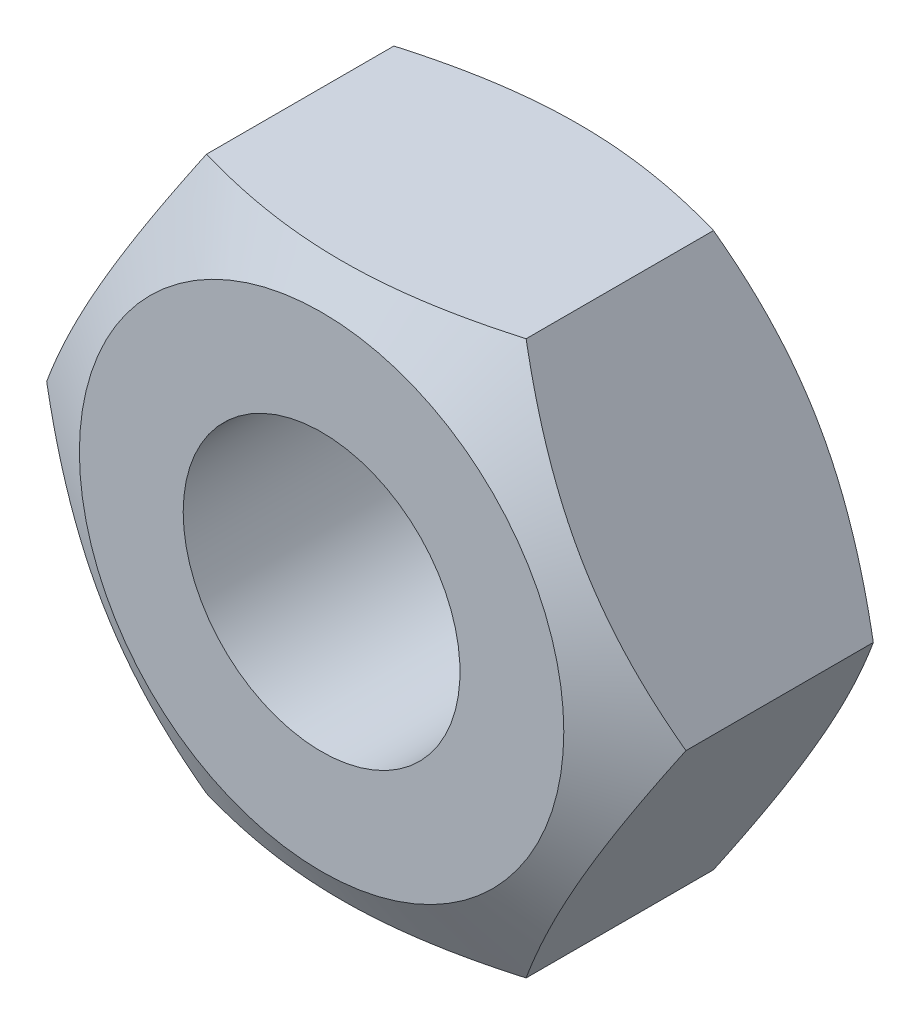
ISO-10303-21;
HEADER;
FILE_DESCRIPTION(('STEP AP214'),'2;1');
FILE_NAME('part.step','',(''),(''),'','','');
FILE_SCHEMA(('AUTOMOTIVE_DESIGN { 1 0 10303 214 1 1 1 1 }'));
ENDSEC;
DATA;
#1=APPLICATION_CONTEXT('core data for automotive mechanical design processes');
#2=APPLICATION_PROTOCOL_DEFINITION('international standard','automotive_design',2000,#1);
#3=PRODUCT_CONTEXT('',#1,'mechanical');
#4=PRODUCT('Part','Part','',(#3));
#5=PRODUCT_RELATED_PRODUCT_CATEGORY('part','',(#4));
#6=PRODUCT_DEFINITION_FORMATION('','',#4);
#7=PRODUCT_DEFINITION_CONTEXT('part definition',#1,'design');
#8=PRODUCT_DEFINITION('design','',#6,#7);
#9=PRODUCT_DEFINITION_SHAPE('','',#8);
#10=(LENGTH_UNIT() NAMED_UNIT(*) SI_UNIT(.MILLI.,.METRE.));
#11=(NAMED_UNIT(*) PLANE_ANGLE_UNIT() SI_UNIT($,.RADIAN.));
#12=(NAMED_UNIT(*) SI_UNIT($,.STERADIAN.) SOLID_ANGLE_UNIT());
#13=UNCERTAINTY_MEASURE_WITH_UNIT(LENGTH_MEASURE(1.E-05),#10,'distance_accuracy_value','');
#14=(GEOMETRIC_REPRESENTATION_CONTEXT(3) GLOBAL_UNCERTAINTY_ASSIGNED_CONTEXT((#13)) GLOBAL_UNIT_ASSIGNED_CONTEXT((#10,
#11,#12)) REPRESENTATION_CONTEXT('',''));
#15=CARTESIAN_POINT('',(0.,0.,0.));
#16=DIRECTION('',(0.,0.,1.));
#17=DIRECTION('',(1.,0.,0.));
#18=AXIS2_PLACEMENT_3D('',#15,#16,#17);
#19=CARTESIAN_POINT('',(0.,0.,5.86282135458305));
#20=DIRECTION('',(0.,0.,-1.));
#21=DIRECTION('',(-1.,0.,0.));
#22=AXIS2_PLACEMENT_3D('',#19,#20,#21);
#23=CONICAL_SURFACE('',#22,8.09465119112929,1.04719755119864);
#24=CARTESIAN_POINT('',(0.,0.,7.00000000002023));
#25=DIRECTION('',(0.,0.,-1.));
#26=DIRECTION('',(-1.,0.,0.));
#27=AXIS2_PLACEMENT_3D('',#24,#25,#26);
#28=CIRCLE('',#27,6.12499999994043);
#29=CARTESIAN_POINT('',(-6.12499999994043,0.,7.00000000002023));
#30=VERTEX_POINT('',#29);
#31=EDGE_CURVE('E20',#30,#30,#28,.F.);
#32=ORIENTED_EDGE('',*,*,#31,.F.);
#33=EDGE_LOOP('',(#32));
#34=FACE_BOUND('',#33,.T.);
#35=CARTESIAN_POINT('',(-4.04145188432504,-7.00000000000002,5.86960373211163));
#36=CARTESIAN_POINT('',(-3.86378247803135,-7.00000000000002,5.92088257720965));
#37=CARTESIAN_POINT('',(-3.68545063654729,-7.00000000000002,5.96983400527788));
#38=CARTESIAN_POINT('',(-3.32733873248749,-7.00000000000002,6.06244103940866));
#39=CARTESIAN_POINT('',(-3.1475580805679,-7.00000000000002,6.10609436093838));
#40=CARTESIAN_POINT('',(-2.60533781451671,-7.00000000000002,6.22825023804331));
#41=CARTESIAN_POINT('',(-2.24075794157661,-7.00000000000002,6.29773001609363));
#42=CARTESIAN_POINT('',(-1.69517083910316,-7.00000000000002,6.37920129290062));
#43=CARTESIAN_POINT('',(-1.51579360730201,-7.00000000000002,6.40240971488172));
#44=CARTESIAN_POINT('',(-1.15622874563318,-7.00000000000002,6.44132591526718));
#45=CARTESIAN_POINT('',(-0.976041188786309,-7.00000000000002,6.45703435636791));
#46=CARTESIAN_POINT('',(-0.615353230628588,-7.00000000000002,6.48055026201443));
#47=CARTESIAN_POINT('',(-0.434853418188718,-7.00000000000002,6.48836669212229));
#48=CARTESIAN_POINT('',(-0.0736971508473852,-7.00000000000002,6.49593936427695));
#49=CARTESIAN_POINT('',(0.106959299040573,-7.00000000000002,6.4956958554197));
#50=CARTESIAN_POINT('',(0.601868045647311,-7.00000000000002,6.48395068731892));
#51=CARTESIAN_POINT('',(0.915958242229462,-7.00000000000002,6.46424356568357));
#52=CARTESIAN_POINT('',(1.54205253151257,-7.00000000000002,6.40175885301141));
#53=CARTESIAN_POINT('',(1.85405442324479,-7.00000000000002,6.35895991638039));
#54=CARTESIAN_POINT('',(2.48140815386124,-7.00000000000002,6.25197764318567));
#55=CARTESIAN_POINT('',(2.79668085475645,-7.00000000000002,6.18734114904723));
#56=CARTESIAN_POINT('',(3.42252533986699,-7.00000000000002,6.04064340283215));
#57=CARTESIAN_POINT('',(3.73310513565769,-7.00000000000002,5.9586165971607));
#58=CARTESIAN_POINT('',(4.04145188432504,-7.00000000000002,5.86960373211163));
#59=B_SPLINE_CURVE_WITH_KNOTS('',3,(#35,#36,#37,#38,#39,#40,#41,#42,#43,#44,#45,#46,#47,#48,#49,
#50,#51,#52,#53,#54,#55,#56,#57,#58),.UNSPECIFIED.,.F.,.F.,(4,2,2,2,2,2,2,2,2,2,2,4),(0.,
0.554720009638788,1.10967836995735,2.22190068910218,2.76439120744652,3.3068337825936,
3.84865943093622,4.39046833393486,5.33360246200363,6.27760990107192,7.2425509015011,
8.20559813009243),.UNSPECIFIED.);
#60=CARTESIAN_POINT('',(-4.04145188432622,-7.00000000000002,5.86960373211129));
#61=VERTEX_POINT('',#60);
#62=CARTESIAN_POINT('',(4.04145188432798,-6.999999999999,5.8696037321113));
#63=VERTEX_POINT('',#62);
#64=EDGE_CURVE('E178',#61,#63,#59,.T.);
#65=ORIENTED_EDGE('',*,*,#64,.T.);
#66=CARTESIAN_POINT('',(4.04145188432855,-6.99999999999797,5.86960373211164));
#67=CARTESIAN_POINT('',(4.1302865874754,-6.84613378067233,5.92088257720966));
#68=CARTESIAN_POINT('',(4.21945250821743,-6.69169387564349,5.96983400527789));
#69=CARTESIAN_POINT('',(4.39850846024733,-6.38155986933008,6.06244103940868));
#70=CARTESIAN_POINT('',(4.48839878620712,-6.2258652576588,6.10609436093839));
#71=CARTESIAN_POINT('',(4.75950891923272,-5.75628873281171,6.22825023804332));
#72=CARTESIAN_POINT('',(4.94179885570276,-5.44055330113708,6.29773001609364));
#73=CARTESIAN_POINT('',(5.21459240693948,-4.96806101041793,6.37920129290063));
#74=CARTESIAN_POINT('',(5.30428102284006,-4.81271577081761,6.40240971488173));
#75=CARTESIAN_POINT('',(5.48406345367447,-4.50132346630416,6.44132591526719));
#76=CARTESIAN_POINT('',(5.57415723209791,-4.34527646462892,6.45703435636792));
#77=CARTESIAN_POINT('',(5.75450121117677,-4.03291153002519,6.48055026201445));
#78=CARTESIAN_POINT('',(5.8447511173967,-3.87659410707394,6.4883666921223));
#79=CARTESIAN_POINT('',(6.02532925106737,-3.56382360482038,6.49593936427696));
#80=CARTESIAN_POINT('',(6.11565747601135,-3.40737052985989,6.49569585541972));
#81=CARTESIAN_POINT('',(6.36311184931439,-2.9787669827439,6.48395068731895));
#82=CARTESIAN_POINT('',(6.52015694760515,-2.70675689342467,6.46424356568367));
#83=CARTESIAN_POINT('',(6.83320409224606,-2.16454333374225,6.40175885301174));
#84=CARTESIAN_POINT('',(6.98920503811185,-1.8943417694739,6.35895991638087));
#85=CARTESIAN_POINT('',(7.30288190341943,-1.35103750160223,6.25197764318654));
#86=CARTESIAN_POINT('',(7.4605182538667,-1.07800333350781,6.18734114904835));
#87=CARTESIAN_POINT('',(7.77344049642134,-0.536006110584801,6.04064340283379));
#88=CARTESIAN_POINT('',(7.92873039431638,-0.267036117528407,5.95861659716263));
#89=CARTESIAN_POINT('',(8.08290376864974,-8.68752666388614E-12,5.86960373211387));
#90=B_SPLINE_CURVE_WITH_KNOTS('',3,(#66,#67,#68,#69,#70,#71,#72,#73,#74,#75,#76,#77,#78,#79,#80,
#81,#82,#83,#84,#85,#86,#87,#88,#89),.UNSPECIFIED.,.F.,.F.,(4,2,2,2,2,2,2,2,2,2,2,4),(0.,
0.554720009638783,1.10967836995734,2.22190068910215,2.76439120744649,3.30683378259358,
3.84865943093621,4.39046833393485,5.33360246200167,6.277609901068,7.24255090149513,
8.20559813008442),.UNSPECIFIED.);
#91=CARTESIAN_POINT('',(8.08290376867273,4.01394656976142E-12,5.86960373210394));
#92=VERTEX_POINT('',#91);
#93=EDGE_CURVE('E185',#63,#92,#90,.T.);
#94=ORIENTED_EDGE('',*,*,#93,.T.);
#95=CARTESIAN_POINT('',(8.08290376864621,6.65778002664904E-12,5.8696037321112));
#96=CARTESIAN_POINT('',(7.99406906550177,0.153866219333274,5.92088257721074));
#97=CARTESIAN_POINT('',(7.90490314476075,0.308306124362572,5.96983400527957));
#98=CARTESIAN_POINT('',(7.72584719273156,0.618440130676378,6.06244103941073));
#99=CARTESIAN_POINT('',(7.63595686677148,0.774134742347623,6.10609436094022));
#100=CARTESIAN_POINT('',(7.36484673374541,1.24371126719469,6.22825023804467));
#101=CARTESIAN_POINT('',(7.18255679727554,1.55944669886948,6.29773001609495));
#102=CARTESIAN_POINT('',(6.90976324603883,2.03193898958874,6.37920129290169));
#103=CARTESIAN_POINT('',(6.82007463013823,2.18728422918908,6.40240971488268));
#104=CARTESIAN_POINT('',(6.64029219930378,2.49867653370256,6.44132591526791));
#105=CARTESIAN_POINT('',(6.55019842088034,2.65472353537782,6.45703435636854));
#106=CARTESIAN_POINT('',(6.36985444180147,2.96708846998157,6.48055026201484));
#107=CARTESIAN_POINT('',(6.27960453558152,3.12340589293284,6.48836669212258));
#108=CARTESIAN_POINT('',(6.09902640191084,3.43617639518643,6.49593936427701));
#109=CARTESIAN_POINT('',(6.00869817696685,3.59262947014693,6.49569585541965));
#110=CARTESIAN_POINT('',(5.7612438036638,4.02123301726292,6.48395068731856));
#111=CARTESIAN_POINT('',(5.60419870537306,4.29324310658214,6.46424356568307));
#112=CARTESIAN_POINT('',(5.29115156073217,4.83545666626453,6.40175885301076));
#113=CARTESIAN_POINT('',(5.13515061486639,5.10565823053286,6.35895991637971));
#114=CARTESIAN_POINT('',(4.82147374955883,5.64896249840448,6.25197764318504));
#115=CARTESIAN_POINT('',(4.66383739911156,5.92199666649889,6.18734114904668));
#116=CARTESIAN_POINT('',(4.35091515655694,6.46399388942188,6.04064340283183));
#117=CARTESIAN_POINT('',(4.1956252586619,6.73296388247827,5.95861659716052));
#118=CARTESIAN_POINT('',(4.04145188432854,6.99999999999799,5.86960373211164));
#119=B_SPLINE_CURVE_WITH_KNOTS('',3,(#95,#96,#97,#98,#99,#100,#101,#102,#103,#104,#105,#106,
#107,#108,#109,#110,#111,#112,#113,#114,#115,#116,#117,#118),.UNSPECIFIED.,.F.,.F.,(4,2,2,2,2,2,
2,2,2,2,2,4),(0.,0.554720009638947,1.10967836995763,2.2219006891026,2.76439120744697,
3.30683378259408,3.84865943093675,4.39046833393543,5.33360246200225,6.27760990106857,
7.24255090149576,8.20559813008513),.UNSPECIFIED.);
#120=CARTESIAN_POINT('',(4.0414518843262,7.00000000000003,5.8696037321113));
#121=VERTEX_POINT('',#120);
#122=EDGE_CURVE('E85',#92,#121,#119,.T.);
#123=ORIENTED_EDGE('',*,*,#122,.T.);
#124=CARTESIAN_POINT('',(4.04145188432502,7.00000000000003,5.86960373211163));
#125=CARTESIAN_POINT('',(3.86378247803133,7.00000000000003,5.92088257720965));
#126=CARTESIAN_POINT('',(3.68545063654728,7.00000000000003,5.96983400527788));
#127=CARTESIAN_POINT('',(3.32733873248747,7.00000000000003,6.06244103940866));
#128=CARTESIAN_POINT('',(3.14755808056788,7.00000000000003,6.10609436093838));
#129=CARTESIAN_POINT('',(2.60533781451669,7.00000000000003,6.22825023804331));
#130=CARTESIAN_POINT('',(2.24075794157659,7.00000000000003,6.29773001609363));
#131=CARTESIAN_POINT('',(1.69517083910314,7.00000000000003,6.37920129290062));
#132=CARTESIAN_POINT('',(1.51579360730199,7.00000000000003,6.40240971488172));
#133=CARTESIAN_POINT('',(1.15622874563316,7.00000000000003,6.44132591526717));
#134=CARTESIAN_POINT('',(0.976041188786289,7.00000000000003,6.4570343563679));
#135=CARTESIAN_POINT('',(0.615353230628569,7.00000000000003,6.48055026201443));
#136=CARTESIAN_POINT('',(0.434853418188698,7.00000000000003,6.48836669212229));
#137=CARTESIAN_POINT('',(0.0736971508473654,7.00000000000003,6.49593936427694));
#138=CARTESIAN_POINT('',(-0.106959299040593,7.00000000000003,6.4956958554197));
#139=CARTESIAN_POINT('',(-0.601868045647329,7.00000000000003,6.48395068731892));
#140=CARTESIAN_POINT('',(-0.915958242229478,7.00000000000003,6.46424356568356));
#141=CARTESIAN_POINT('',(-1.54205253151259,7.00000000000003,6.40175885301141));
#142=CARTESIAN_POINT('',(-1.8540544232448,7.00000000000003,6.35895991638038));
#143=CARTESIAN_POINT('',(-2.48140815386125,7.00000000000003,6.25197764318566));
#144=CARTESIAN_POINT('',(-2.79668085475645,7.00000000000003,6.18734114904723));
#145=CARTESIAN_POINT('',(-3.42252533986699,7.00000000000003,6.04064340283215));
#146=CARTESIAN_POINT('',(-3.73310513565769,7.00000000000003,5.95861659716069));
#147=CARTESIAN_POINT('',(-4.04145188432504,7.00000000000003,5.86960373211163));
#148=B_SPLINE_CURVE_WITH_KNOTS('',3,(#124,#125,#126,#127,#128,#129,#130,#131,#132,#133,#134,
#135,#136,#137,#138,#139,#140,#141,#142,#143,#144,#145,#146,#147),.UNSPECIFIED.,.F.,.F.,(4,2,2,
2,2,2,2,2,2,2,2,4),(0.,0.554720009638788,1.10967836995735,2.22190068910218,2.76439120744652,
3.3068337825936,3.84865943093622,4.39046833393486,5.33360246200362,6.27760990107191,
7.24255090150109,8.2055981300924),.UNSPECIFIED.);
#149=CARTESIAN_POINT('',(-4.04145188432798,6.99999999999901,5.86960373211129));
#150=VERTEX_POINT('',#149);
#151=EDGE_CURVE('E79',#121,#150,#148,.T.);
#152=ORIENTED_EDGE('',*,*,#151,.T.);
#153=CARTESIAN_POINT('',(-4.04145188432857,6.99999999999799,5.86960373211163));
#154=CARTESIAN_POINT('',(-4.13028658747542,6.84613378067236,5.92088257720965));
#155=CARTESIAN_POINT('',(-4.21945250821744,6.69169387564351,5.96983400527787));
#156=CARTESIAN_POINT('',(-4.39850846024734,6.3815598693301,6.06244103940866));
#157=CARTESIAN_POINT('',(-4.48839878620714,6.22586525765881,6.10609436093838));
#158=CARTESIAN_POINT('',(-4.75950891923273,5.75628873281172,6.22825023804331));
#159=CARTESIAN_POINT('',(-4.94179885570278,5.4405533011371,6.29773001609362));
#160=CARTESIAN_POINT('',(-5.2145924069395,4.96806101041795,6.37920129290062));
#161=CARTESIAN_POINT('',(-5.30428102284008,4.81271577081762,6.40240971488172));
#162=CARTESIAN_POINT('',(-5.4840634536745,4.50132346630417,6.44132591526717));
#163=CARTESIAN_POINT('',(-5.57415723209793,4.34527646462893,6.4570343563679));
#164=CARTESIAN_POINT('',(-5.75450121117679,4.0329115300252,6.48055026201443));
#165=CARTESIAN_POINT('',(-5.84475111739673,3.87659410707395,6.48836669212229));
#166=CARTESIAN_POINT('',(-6.0253292510674,3.56382360482039,6.49593936427695));
#167=CARTESIAN_POINT('',(-6.11565747601138,3.4073705298599,6.4956958554197));
#168=CARTESIAN_POINT('',(-6.36311184931442,2.97876698274391,6.48395068731894));
#169=CARTESIAN_POINT('',(-6.52015694760517,2.70675689342468,6.46424356568365));
#170=CARTESIAN_POINT('',(-6.83320409224609,2.16454333374225,6.40175885301172));
#171=CARTESIAN_POINT('',(-6.98920503811188,1.89434176947389,6.35895991638085));
#172=CARTESIAN_POINT('',(-7.30288190341946,1.35103750160222,6.25197764318653));
#173=CARTESIAN_POINT('',(-7.46051825386674,1.0780033335078,6.18734114904833));
#174=CARTESIAN_POINT('',(-7.77344049642138,0.536006110584787,6.04064340283377));
#175=CARTESIAN_POINT('',(-7.92873039431642,0.26703611752839,5.9586165971626));
#176=CARTESIAN_POINT('',(-8.08290376864978,8.66782772580989E-12,5.86960373211384));
#177=B_SPLINE_CURVE_WITH_KNOTS('',3,(#153,#154,#155,#156,#157,#158,#159,#160,#161,#162,#163,
#164,#165,#166,#167,#168,#169,#170,#171,#172,#173,#174,#175,#176),.UNSPECIFIED.,.F.,.F.,(4,2,2,
2,2,2,2,2,2,2,2,4),(0.,0.554720009638786,1.10967836995734,2.22190068910216,2.76439120744651,
3.30683378259359,3.84865943093622,4.39046833393486,5.33360246200169,6.27760990106804,
7.24255090149517,8.20559813008447),.UNSPECIFIED.);
#178=CARTESIAN_POINT('',(-8.08290376862838,0.,5.86960373212264));
#179=VERTEX_POINT('',#178);
#180=EDGE_CURVE('E68',#150,#179,#177,.T.);
#181=ORIENTED_EDGE('',*,*,#180,.T.);
#182=CARTESIAN_POINT('',(-8.08290376864624,-6.69908526011561E-12,5.86960373211119));
#183=CARTESIAN_POINT('',(-7.99406906550179,-0.153866219333313,5.92088257721073));
#184=CARTESIAN_POINT('',(-7.90490314476077,-0.30830612436261,5.96983400527956));
#185=CARTESIAN_POINT('',(-7.72584719273158,-0.618440130676416,6.06244103941072));
#186=CARTESIAN_POINT('',(-7.6359568667715,-0.774134742347661,6.10609436094021));
#187=CARTESIAN_POINT('',(-7.36484673374543,-1.24371126719473,6.22825023804466));
#188=CARTESIAN_POINT('',(-7.18255679727555,-1.55944669886951,6.29773001609494));
#189=CARTESIAN_POINT('',(-6.90976324603885,-2.03193898958878,6.37920129290168));
#190=CARTESIAN_POINT('',(-6.82007463013825,-2.18728422918912,6.40240971488267));
#191=CARTESIAN_POINT('',(-6.6402921993038,-2.4986765337026,6.4413259152679));
#192=CARTESIAN_POINT('',(-6.55019842088036,-2.65472353537786,6.45703435636852));
#193=CARTESIAN_POINT('',(-6.36985444180148,-2.96708846998161,6.48055026201483));
#194=CARTESIAN_POINT('',(-6.27960453558153,-3.12340589293289,6.48836669212257));
#195=CARTESIAN_POINT('',(-6.09902640191085,-3.43617639518647,6.49593936427699));
#196=CARTESIAN_POINT('',(-6.00869817696686,-3.59262947014697,6.49569585541963));
#197=CARTESIAN_POINT('',(-5.76124380366381,-4.02123301726296,6.48395068731854));
#198=CARTESIAN_POINT('',(-5.60419870537307,-4.29324310658218,6.46424356568306));
#199=CARTESIAN_POINT('',(-5.29115156073218,-4.83545666626456,6.40175885301074));
#200=CARTESIAN_POINT('',(-5.13515061486641,-5.10565823053288,6.35895991637969));
#201=CARTESIAN_POINT('',(-4.82147374955885,-5.6489624984045,6.25197764318503));
#202=CARTESIAN_POINT('',(-4.66383739911158,-5.9219966664989,6.18734114904667));
#203=CARTESIAN_POINT('',(-4.35091515655697,-6.46399388942189,6.04064340283182));
#204=CARTESIAN_POINT('',(-4.19562525866193,-6.73296388247828,5.95861659716051));
#205=CARTESIAN_POINT('',(-4.04145188432857,-6.99999999999799,5.86960373211163));
#206=B_SPLINE_CURVE_WITH_KNOTS('',3,(#182,#183,#184,#185,#186,#187,#188,#189,#190,#191,#192,
#193,#194,#195,#196,#197,#198,#199,#200,#201,#202,#203,#204,#205),.UNSPECIFIED.,.F.,.F.,(4,2,2,
2,2,2,2,2,2,2,2,4),(0.,0.554720009638946,1.10967836995763,2.2219006891026,2.76439120744698,
3.30683378259408,3.84865943093675,4.39046833393544,5.33360246200225,6.27760990106856,
7.24255090149573,8.20559813008509),.UNSPECIFIED.);
#207=EDGE_CURVE('E170',#179,#61,#206,.T.);
#208=ORIENTED_EDGE('',*,*,#207,.T.);
#209=EDGE_LOOP('',(#65,#94,#123,#152,#181,#208));
#210=FACE_BOUND('',#209,.T.);
#211=ADVANCED_FACE('F16',(#34,#210),#23,.T.);
#212=CARTESIAN_POINT('',(0.,0.,7.));
#213=DIRECTION('',(0.,0.,1.));
#214=DIRECTION('',(1.,0.,0.));
#215=AXIS2_PLACEMENT_3D('',#212,#213,#214);
#216=PLANE('',#215);
#217=CARTESIAN_POINT('',(0.,0.,7.));
#218=DIRECTION('',(0.,0.,-1.));
#219=DIRECTION('',(-1.,0.,0.));
#220=AXIS2_PLACEMENT_3D('',#217,#218,#219);
#221=CIRCLE('',#220,3.5);
#222=CARTESIAN_POINT('',(-3.5,0.,7.));
#223=VERTEX_POINT('',#222);
#224=EDGE_CURVE('E177',#223,#223,#221,.T.);
#225=ORIENTED_EDGE('',*,*,#224,.T.);
#226=EDGE_LOOP('',(#225));
#227=FACE_BOUND('',#226,.T.);
#228=ORIENTED_EDGE('',*,*,#31,.T.);
#229=EDGE_LOOP('',(#228));
#230=FACE_BOUND('',#229,.T.);
#231=ADVANCED_FACE('F217',(#227,#230),#216,.T.);
#232=CARTESIAN_POINT('',(-4.04145188432739,7.00000000000003,7.));
#233=DIRECTION('',(0.866025403784439,-0.5,0.));
#234=DIRECTION('',(0.5,0.866025403784439,0.));
#235=AXIS2_PLACEMENT_3D('',#232,#233,#234);
#236=PLANE('',#235);
#237=ORIENTED_EDGE('',*,*,#180,.F.);
#238=DIRECTION('',(0.,0.,-1.));
#239=VECTOR('',#238,1.);
#240=CARTESIAN_POINT('',(-4.04145188432739,7.00000000000003,7.));
#241=LINE('',#240,#239);
#242=CARTESIAN_POINT('',(-4.04145190597834,6.99999996249948,1.13039625538003));
#243=VERTEX_POINT('',#242);
#244=EDGE_CURVE('E72',#150,#243,#241,.T.);
#245=ORIENTED_EDGE('',*,*,#244,.T.);
#246=CARTESIAN_POINT('',(-8.08290376865479,0.,1.13039626788021));
#247=CARTESIAN_POINT('',(-7.99406906551491,0.15386621931356,1.07911742278595));
#248=CARTESIAN_POINT('',(-7.9049031447799,0.30830612433026,1.03016599472112));
#249=CARTESIAN_POINT('',(-7.72584719276414,0.618440130619167,0.937558960596276));
#250=CARTESIAN_POINT('',(-7.63595686681148,0.774134742278111,0.893905639069099));
#251=CARTESIAN_POINT('',(-7.36484673380923,1.24371126708476,0.771749761971067));
#252=CARTESIAN_POINT('',(-7.18255679735559,1.55944669873096,0.702269983923331));
#253=CARTESIAN_POINT('',(-6.90976324612815,2.03193898943403,0.620798707111201));
#254=CARTESIAN_POINT('',(-6.82007463022029,2.18728422904699,0.597590285125838));
#255=CARTESIAN_POINT('',(-6.64029219937117,2.49867653358589,0.558674084733059));
#256=CARTESIAN_POINT('',(-6.55019842094034,2.65472353527395,0.542965643629266));
#257=CARTESIAN_POINT('',(-6.36985444184581,2.96708846990481,0.519449737977663));
#258=CARTESIAN_POINT('',(-6.27960453561761,3.12340589287039,0.511633307867871));
#259=CARTESIAN_POINT('',(-6.09902640193047,3.43617639515247,0.504060635711356));
#260=CARTESIAN_POINT('',(-6.00869817697829,3.59262947012716,0.504304144568651));
#261=CARTESIAN_POINT('',(-5.76124380732308,4.02123301092492,0.516049312494969));
#262=CARTESIAN_POINT('',(-5.60419871268358,4.29324309391999,0.53575643338358));
#263=CARTESIAN_POINT('',(-5.29115157528364,4.83545664106068,0.598241143534258));
#264=CARTESIAN_POINT('',(-5.13515063300741,5.10565819911173,0.641040078388103));
#265=CARTESIAN_POINT('',(-4.82147377496226,5.6489624544045,0.748022347151631));
#266=CARTESIAN_POINT('',(-4.66383742818429,5.92199661614349,0.812658838603964));
#267=CARTESIAN_POINT('',(-4.35091519283479,6.46399382658686,0.959356578862656));
#268=CARTESIAN_POINT('',(-4.19562529847605,6.7329638135182,1.04138338126738));
#269=CARTESIAN_POINT('',(-4.0414519276293,6.99999992499894,1.13039624287985));
#270=B_SPLINE_CURVE_WITH_KNOTS('',3,(#246,#247,#248,#249,#250,#251,#252,#253,#254,#255,#256,
#257,#258,#259,#260,#261,#262,#263,#264,#265,#266,#267,#268,#269),.UNSPECIFIED.,.F.,.F.,(4,2,2,
2,2,2,2,2,2,2,2,4),(0.,0.554720009595517,1.10967836987073,2.22190068891774,2.76439120730711,
3.30683378249913,3.84865943089178,4.39046833393852,5.33360244007101,6.27760985712187,
7.24255083439048,8.20559803999755),.UNSPECIFIED.);
#271=CARTESIAN_POINT('',(-8.08290376865479,0.,1.13039626788021));
#272=VERTEX_POINT('',#271);
#273=EDGE_CURVE('E124',#272,#243,#270,.T.);
#274=ORIENTED_EDGE('',*,*,#273,.F.);
#275=DIRECTION('',(0.,0.,1.));
#276=VECTOR('',#275,1.);
#277=CARTESIAN_POINT('',(-8.08290376865479,0.,7.));
#278=LINE('',#277,#276);
#279=EDGE_CURVE('E74',#272,#179,#278,.T.);
#280=ORIENTED_EDGE('',*,*,#279,.T.);
#281=EDGE_LOOP('',(#237,#245,#274,#280));
#282=FACE_BOUND('',#281,.T.);
#283=ADVANCED_FACE('F70',(#282),#236,.F.);
#284=CARTESIAN_POINT('',(4.04145188432736,7.00000000000003,7.));
#285=DIRECTION('',(0.,-1.,0.));
#286=DIRECTION('',(0.,0.,-1.));
#287=AXIS2_PLACEMENT_3D('',#284,#285,#286);
#288=PLANE('',#287);
#289=ORIENTED_EDGE('',*,*,#151,.F.);
#290=DIRECTION('',(0.,0.,1.));
#291=VECTOR('',#290,1.);
#292=CARTESIAN_POINT('',(4.04145188432737,7.00000000000002,7.));
#293=LINE('',#292,#291);
#294=CARTESIAN_POINT('',(4.04145184102547,7.00000000000003,1.13039625538002));
#295=VERTEX_POINT('',#294);
#296=EDGE_CURVE('E190',#121,#295,#293,.F.);
#297=ORIENTED_EDGE('',*,*,#296,.T.);
#298=CARTESIAN_POINT('',(-4.04145191763655,7.00000000000003,1.13039627749574));
#299=CARTESIAN_POINT('',(-3.86378251108173,7.00000000000003,1.07911743200519));
#300=CARTESIAN_POINT('',(-3.68545066933531,7.00000000000003,1.03016600353433));
#301=CARTESIAN_POINT('',(-3.32733876474527,7.00000000000003,0.937558968579371));
#302=CARTESIAN_POINT('',(-3.14755811255781,7.00000000000003,0.893905646628119));
#303=CARTESIAN_POINT('',(-2.60533784567551,7.00000000000003,0.77174976822788));
#304=CARTESIAN_POINT('',(-2.24075797215952,7.00000000000003,0.702269989278798));
#305=CARTESIAN_POINT('',(-1.69517086877575,7.00000000000003,0.620798711120094));
#306=CARTESIAN_POINT('',(-1.51579363666468,7.00000000000003,0.5975902886933));
#307=CARTESIAN_POINT('',(-1.15622877435842,7.00000000000003,0.558674087422289));
#308=CARTESIAN_POINT('',(-0.976041217184046,7.00000000000003,0.542965645881691));
#309=CARTESIAN_POINT('',(-0.615353258353871,7.00000000000003,0.519449739372336));
#310=CARTESIAN_POINT('',(-0.434853445569077,7.00000000000003,0.511633308841449));
#311=CARTESIAN_POINT('',(-0.0736971775195825,7.00000000000003,0.504060635868642));
#312=CARTESIAN_POINT('',(0.106959272731613,7.00000000000003,0.50430414433074));
#313=CARTESIAN_POINT('',(0.601868014514687,7.00000000000003,0.516049311260159));
#314=CARTESIAN_POINT('',(0.915958205934689,7.00000000000003,0.535756431701367));
#315=CARTESIAN_POINT('',(1.5420524850231,7.00000000000003,0.598241141315537));
#316=CARTESIAN_POINT('',(1.85405437172302,7.00000000000003,0.641040076081064));
#317=CARTESIAN_POINT('',(2.48140809218476,7.00000000000003,0.748022344998094));
#318=CARTESIAN_POINT('',(2.79668078796306,7.00000000000003,0.812658836703797));
#319=CARTESIAN_POINT('',(3.42252526303832,7.00000000000003,0.959356577733388));
#320=CARTESIAN_POINT('',(3.73310505390992,7.00000000000003,1.04138338065458));
#321=CARTESIAN_POINT('',(4.04145179772356,7.00000000000003,1.13039624287984));
#322=B_SPLINE_CURVE_WITH_KNOTS('',3,(#298,#299,#300,#301,#302,#303,#304,#305,#306,#307,#308,
#309,#310,#311,#312,#313,#314,#315,#316,#317,#318,#319,#320,#321),.UNSPECIFIED.,.F.,.F.,(4,2,2,
2,2,2,2,2,2,2,2,4),(0.,0.554720010718176,1.10967837211669,2.22190069346874,2.76439121290675,
3.30683378914705,3.84865943857788,4.39046834266292,5.33360245509882,6.27760987847744,
7.2425508624168,8.20559807465201),.UNSPECIFIED.);
#323=EDGE_CURVE('E84',#243,#295,#322,.T.);
#324=ORIENTED_EDGE('',*,*,#323,.F.);
#325=ORIENTED_EDGE('',*,*,#244,.F.);
#326=EDGE_LOOP('',(#289,#297,#324,#325));
#327=FACE_BOUND('',#326,.T.);
#328=ADVANCED_FACE('F81',(#327),#288,.F.);
#329=CARTESIAN_POINT('',(8.08290376865476,0.,7.));
#330=DIRECTION('',(-0.866025403784439,-0.5,0.));
#331=DIRECTION('',(0.5,-0.866025403784439,0.));
#332=AXIS2_PLACEMENT_3D('',#329,#330,#331);
#333=PLANE('',#332);
#334=ORIENTED_EDGE('',*,*,#122,.F.);
#335=DIRECTION('',(0.,0.,1.));
#336=VECTOR('',#335,1.);
#337=CARTESIAN_POINT('',(8.08290376865474,0.,7.));
#338=LINE('',#337,#336);
#339=CARTESIAN_POINT('',(8.08290376865476,0.,1.13039626788019));
#340=VERTEX_POINT('',#339);
#341=EDGE_CURVE('E184',#92,#340,#338,.F.);
#342=ORIENTED_EDGE('',*,*,#341,.T.);
#343=CARTESIAN_POINT('',(4.04145186767279,7.0000000288466,1.13039627749573));
#344=CARTESIAN_POINT('',(4.13028657095721,6.84613380928268,1.07911743200114));
#345=CARTESIAN_POINT('',(4.21945249183748,6.69169390401438,1.03016600352659));
#346=CARTESIAN_POINT('',(4.39850844414676,6.38155989721709,0.937558968565155));
#347=CARTESIAN_POINT('',(4.48839877024768,6.22586528530136,0.893905646611107));
#348=CARTESIAN_POINT('',(4.75950890371236,5.75628875969374,0.771749768203249));
#349=CARTESIAN_POINT('',(4.94179884048691,5.4405533274917,0.702269989251168));
#350=CARTESIAN_POINT('',(5.21459239218829,4.96806103596775,0.620798711097122));
#351=CARTESIAN_POINT('',(5.30428100823659,4.81271579611157,0.597590288674456));
#352=CARTESIAN_POINT('',(5.48406343937514,4.50132349107134,0.558674087410545));
#353=CARTESIAN_POINT('',(5.57415721795498,4.34527648912519,0.542965645872922));
#354=CARTESIAN_POINT('',(5.75450119735453,4.03291155396603,0.519449739368507));
#355=CARTESIAN_POINT('',(5.84475110373872,3.87659413073027,0.511633308839514));
#356=CARTESIAN_POINT('',(6.02532923774712,3.56382362789174,0.504060635868527));
#357=CARTESIAN_POINT('',(6.11565746286458,3.40737055263078,0.50430414433058));
#358=CARTESIAN_POINT('',(6.36311183740442,2.9787670033726,0.516049311434551));
#359=CARTESIAN_POINT('',(6.52015693676608,2.70675691219849,0.535756432622622));
#360=CARTESIAN_POINT('',(6.83320408355206,2.16454334880071,0.59824114475865));
#361=CARTESIAN_POINT('',(6.98920503049197,1.89434178267192,0.641040081301607));
#362=CARTESIAN_POINT('',(7.30288189798608,1.35103751101308,0.748022354650455));
#363=CARTESIAN_POINT('',(7.46051824954495,1.07800334099333,0.81265884904264));
#364=CARTESIAN_POINT('',(7.7734404942885,0.536006114278997,0.959356596029466));
#365=CARTESIAN_POINT('',(7.92873039326098,0.267036119356415,1.04138340221786));
#366=CARTESIAN_POINT('',(8.08290376865478,0.,1.1303962678802));
#367=B_SPLINE_CURVE_WITH_KNOTS('',3,(#343,#344,#345,#346,#347,#348,#349,#350,#351,#352,#353,
#354,#355,#356,#357,#358,#359,#360,#361,#362,#363,#364,#365,#366),.UNSPECIFIED.,.F.,.F.,(4,2,2,
2,2,2,2,2,2,2,2,4),(0.,0.554720010761962,1.10967837220434,2.22190069365527,2.76439121304863,
3.30683378924438,3.84865943862555,4.39046834266286,5.33360247703555,6.27760992243213,
7.24255092953282,8.20559816475301),.UNSPECIFIED.);
#368=EDGE_CURVE('E123',#295,#340,#367,.T.);
#369=ORIENTED_EDGE('',*,*,#368,.F.);
#370=ORIENTED_EDGE('',*,*,#296,.F.);
#371=EDGE_LOOP('',(#334,#342,#369,#370));
#372=FACE_BOUND('',#371,.T.);
#373=ADVANCED_FACE('F110',(#372),#333,.F.);
#374=CARTESIAN_POINT('',(4.04145188432737,-7.00000000000002,7.));
#375=DIRECTION('',(-0.866025403784439,0.499999999999999,0.));
#376=DIRECTION('',(-0.499999999999999,-0.866025403784439,0.));
#377=AXIS2_PLACEMENT_3D('',#374,#375,#376);
#378=PLANE('',#377);
#379=ORIENTED_EDGE('',*,*,#93,.F.);
#380=DIRECTION('',(0.,0.,1.));
#381=VECTOR('',#380,1.);
#382=CARTESIAN_POINT('',(4.04145188432741,-7.00000000000002,7.));
#383=LINE('',#382,#381);
#384=CARTESIAN_POINT('',(4.04145190597834,-6.99999996249948,1.13039625538002));
#385=VERTEX_POINT('',#384);
#386=EDGE_CURVE('E183',#63,#385,#383,.F.);
#387=ORIENTED_EDGE('',*,*,#386,.T.);
#388=CARTESIAN_POINT('',(8.08290376865476,0.,1.13039626788019));
#389=CARTESIAN_POINT('',(7.99406906551487,-0.153866219313569,1.07911742278592));
#390=CARTESIAN_POINT('',(7.90490314477986,-0.308306124330269,1.0301659947211));
#391=CARTESIAN_POINT('',(7.72584719276411,-0.618440130619175,0.937558960596254));
#392=CARTESIAN_POINT('',(7.63595686681144,-0.774134742278119,0.893905639069078));
#393=CARTESIAN_POINT('',(7.3648467338092,-1.24371126708477,0.771749761971047));
#394=CARTESIAN_POINT('',(7.18255679735556,-1.55944669873097,0.702269983923312));
#395=CARTESIAN_POINT('',(6.90976324612812,-2.03193898943403,0.620798707111182));
#396=CARTESIAN_POINT('',(6.82007463022025,-2.18728422904699,0.59759028512582));
#397=CARTESIAN_POINT('',(6.64029219937114,-2.49867653358589,0.558674084733042));
#398=CARTESIAN_POINT('',(6.55019842094031,-2.65472353527395,0.542965643629249));
#399=CARTESIAN_POINT('',(6.36985444184578,-2.96708846990481,0.519449737977647));
#400=CARTESIAN_POINT('',(6.27960453561758,-3.12340589287038,0.511633307867855));
#401=CARTESIAN_POINT('',(6.09902640193044,-3.43617639515247,0.504060635711341));
#402=CARTESIAN_POINT('',(6.00869817697826,-3.59262947012716,0.504304144568637));
#403=CARTESIAN_POINT('',(5.76124380732305,-4.02123301092491,0.516049312494954));
#404=CARTESIAN_POINT('',(5.60419871268356,-4.29324309391998,0.535756433383566));
#405=CARTESIAN_POINT('',(5.29115157528361,-4.83545664106068,0.598241143534245));
#406=CARTESIAN_POINT('',(5.13515063300739,-5.10565819911172,0.64104007838809));
#407=CARTESIAN_POINT('',(4.82147377496224,-5.64896245440449,0.748022347151618));
#408=CARTESIAN_POINT('',(4.66383742818427,-5.92199661614349,0.812658838603951));
#409=CARTESIAN_POINT('',(4.35091519283476,-6.46399382658685,0.959356578862644));
#410=CARTESIAN_POINT('',(4.19562529847603,-6.73296381351819,1.04138338126737));
#411=CARTESIAN_POINT('',(4.04145192762927,-6.99999992499893,1.13039624287984));
#412=B_SPLINE_CURVE_WITH_KNOTS('',3,(#388,#389,#390,#391,#392,#393,#394,#395,#396,#397,#398,
#399,#400,#401,#402,#403,#404,#405,#406,#407,#408,#409,#410,#411),.UNSPECIFIED.,.F.,.F.,(4,2,2,
2,2,2,2,2,2,2,2,4),(0.,0.554720009595515,1.10967836987072,2.22190068891773,2.7643912073071,
3.30683378249911,3.84865943089176,4.3904683339385,5.33360244007098,6.27760985712185,
7.24255083439045,8.20559803999752),.UNSPECIFIED.);
#413=EDGE_CURVE('E196',#340,#385,#412,.T.);
#414=ORIENTED_EDGE('',*,*,#413,.F.);
#415=ORIENTED_EDGE('',*,*,#341,.F.);
#416=EDGE_LOOP('',(#379,#387,#414,#415));
#417=FACE_BOUND('',#416,.T.);
#418=ADVANCED_FACE('F191',(#417),#378,.F.);
#419=CARTESIAN_POINT('',(-4.0414518843274,-7.00000000000002,7.));
#420=DIRECTION('',(0.,1.,0.));
#421=DIRECTION('',(0.,0.,1.));
#422=AXIS2_PLACEMENT_3D('',#419,#420,#421);
#423=PLANE('',#422);
#424=ORIENTED_EDGE('',*,*,#64,.F.);
#425=DIRECTION('',(0.,0.,1.));
#426=VECTOR('',#425,1.);
#427=CARTESIAN_POINT('',(-4.0414518843274,-7.00000000000002,7.));
#428=LINE('',#427,#426);
#429=CARTESIAN_POINT('',(-4.04145184102549,-7.00000000000002,1.13039625538003));
#430=VERTEX_POINT('',#429);
#431=EDGE_CURVE('E176',#61,#430,#428,.F.);
#432=ORIENTED_EDGE('',*,*,#431,.T.);
#433=CARTESIAN_POINT('',(4.04145191763653,-7.00000000000002,1.13039627749573));
#434=CARTESIAN_POINT('',(3.86378251108171,-7.00000000000002,1.07911743200518));
#435=CARTESIAN_POINT('',(3.68545066933529,-7.00000000000002,1.03016600353432));
#436=CARTESIAN_POINT('',(3.32733876474525,-7.00000000000002,0.937558968579361));
#437=CARTESIAN_POINT('',(3.14755811255778,-7.00000000000002,0.893905646628109));
#438=CARTESIAN_POINT('',(2.60533784567549,-7.00000000000002,0.77174976822787));
#439=CARTESIAN_POINT('',(2.2407579721595,-7.00000000000002,0.702269989278789));
#440=CARTESIAN_POINT('',(1.69517086877574,-7.00000000000002,0.620798711120086));
#441=CARTESIAN_POINT('',(1.51579363666467,-7.00000000000002,0.597590288693293));
#442=CARTESIAN_POINT('',(1.1562287743584,-7.00000000000002,0.558674087422282));
#443=CARTESIAN_POINT('',(0.976041217184029,-7.00000000000002,0.542965645881685));
#444=CARTESIAN_POINT('',(0.615353258353855,-7.00000000000002,0.519449739372329));
#445=CARTESIAN_POINT('',(0.434853445569061,-7.00000000000002,0.511633308841443));
#446=CARTESIAN_POINT('',(0.0736971775195684,-7.00000000000002,0.504060635868636));
#447=CARTESIAN_POINT('',(-0.106959272731627,-7.00000000000002,0.504304144330734));
#448=CARTESIAN_POINT('',(-0.601868014514701,-7.00000000000002,0.516049311260155));
#449=CARTESIAN_POINT('',(-0.915958205934704,-7.00000000000002,0.535756431701363));
#450=CARTESIAN_POINT('',(-1.54205248502312,-7.00000000000002,0.598241141315534));
#451=CARTESIAN_POINT('',(-1.85405437172304,-7.00000000000002,0.641040076081061));
#452=CARTESIAN_POINT('',(-2.48140809218478,-7.00000000000002,0.748022344998093));
#453=CARTESIAN_POINT('',(-2.79668078796308,-7.00000000000002,0.812658836703796));
#454=CARTESIAN_POINT('',(-3.42252526303834,-7.00000000000002,0.959356577733389));
#455=CARTESIAN_POINT('',(-3.73310505390994,-7.00000000000002,1.04138338065458));
#456=CARTESIAN_POINT('',(-4.04145179772358,-7.00000000000002,1.13039624287984));
#457=B_SPLINE_CURVE_WITH_KNOTS('',3,(#433,#434,#435,#436,#437,#438,#439,#440,#441,#442,#443,
#444,#445,#446,#447,#448,#449,#450,#451,#452,#453,#454,#455,#456),.UNSPECIFIED.,.F.,.F.,(4,2,2,
2,2,2,2,2,2,2,2,4),(0.,0.554720010718174,1.10967837211668,2.22190069346874,2.76439121290675,
3.30683378914705,3.84865943857787,4.3904683426629,5.33360245509881,6.27760987847743,
7.2425508624168,8.20559807465201),.UNSPECIFIED.);
#458=EDGE_CURVE('E35',#385,#430,#457,.T.);
#459=ORIENTED_EDGE('',*,*,#458,.F.);
#460=ORIENTED_EDGE('',*,*,#386,.F.);
#461=EDGE_LOOP('',(#424,#432,#459,#460));
#462=FACE_BOUND('',#461,.T.);
#463=ADVANCED_FACE('F165',(#462),#423,.F.);
#464=CARTESIAN_POINT('',(-8.08290376865479,0.,7.));
#465=DIRECTION('',(0.866025403784438,0.500000000000001,0.));
#466=DIRECTION('',(-0.500000000000001,0.866025403784438,0.));
#467=AXIS2_PLACEMENT_3D('',#464,#465,#466);
#468=PLANE('',#467);
#469=ORIENTED_EDGE('',*,*,#207,.F.);
#470=ORIENTED_EDGE('',*,*,#279,.F.);
#471=CARTESIAN_POINT('',(-4.04145186767282,-7.0000000288466,1.13039627749574));
#472=CARTESIAN_POINT('',(-4.13028657095724,-6.84613380928268,1.07911743200114));
#473=CARTESIAN_POINT('',(-4.21945249183751,-6.69169390401438,1.0301660035266));
#474=CARTESIAN_POINT('',(-4.39850844414679,-6.38155989721709,0.937558968565164));
#475=CARTESIAN_POINT('',(-4.48839877024771,-6.22586528530136,0.893905646611116));
#476=CARTESIAN_POINT('',(-4.75950890371239,-5.75628875969374,0.771749768203259));
#477=CARTESIAN_POINT('',(-4.94179884048695,-5.4405533274917,0.702269989251179));
#478=CARTESIAN_POINT('',(-5.21459239218833,-4.96806103596775,0.620798711097134));
#479=CARTESIAN_POINT('',(-5.30428100823662,-4.81271579611156,0.597590288674469));
#480=CARTESIAN_POINT('',(-5.48406343937517,-4.50132349107133,0.558674087410559));
#481=CARTESIAN_POINT('',(-5.57415721795502,-4.34527648912518,0.542965645872936));
#482=CARTESIAN_POINT('',(-5.75450119735456,-4.03291155396602,0.519449739368522));
#483=CARTESIAN_POINT('',(-5.84475110373875,-3.87659413073026,0.51163330883953));
#484=CARTESIAN_POINT('',(-6.02532923774716,-3.56382362789173,0.504060635868544));
#485=CARTESIAN_POINT('',(-6.11565746286461,-3.40737055263078,0.504304144330598));
#486=CARTESIAN_POINT('',(-6.36311183740446,-2.9787670033726,0.516049311434569));
#487=CARTESIAN_POINT('',(-6.52015693676612,-2.70675691219849,0.535756432622641));
#488=CARTESIAN_POINT('',(-6.83320408355209,-2.16454334880072,0.59824114475867));
#489=CARTESIAN_POINT('',(-6.98920503049201,-1.89434178267193,0.641040081301626));
#490=CARTESIAN_POINT('',(-7.3028818979861,-1.3510375110131,0.748022354650473));
#491=CARTESIAN_POINT('',(-7.46051824954497,-1.07800334099335,0.812658849042657));
#492=CARTESIAN_POINT('',(-7.77344049428852,-0.536006114279026,0.959356596029481));
#493=CARTESIAN_POINT('',(-7.92873039326101,-0.267036119356446,1.04138340221787));
#494=CARTESIAN_POINT('',(-8.08290376865479,0.,1.13039626788021));
#495=B_SPLINE_CURVE_WITH_KNOTS('',3,(#471,#472,#473,#474,#475,#476,#477,#478,#479,#480,#481,
#482,#483,#484,#485,#486,#487,#488,#489,#490,#491,#492,#493,#494),.UNSPECIFIED.,.F.,.F.,(4,2,2,
2,2,2,2,2,2,2,2,4),(0.,0.55472001076196,1.10967837220434,2.22190069365527,2.76439121304864,
3.30683378924439,3.84865943862555,4.39046834266286,5.33360247703555,6.27760992243211,
7.24255092953279,8.20559816475297),.UNSPECIFIED.);
#496=EDGE_CURVE('E156',#430,#272,#495,.T.);
#497=ORIENTED_EDGE('',*,*,#496,.F.);
#498=ORIENTED_EDGE('',*,*,#431,.F.);
#499=EDGE_LOOP('',(#469,#470,#497,#498));
#500=FACE_BOUND('',#499,.T.);
#501=ADVANCED_FACE('F162',(#500),#468,.F.);
#502=CARTESIAN_POINT('',(0.,0.,7.));
#503=DIRECTION('',(0.,0.,-1.));
#504=DIRECTION('',(-1.,0.,0.));
#505=AXIS2_PLACEMENT_3D('',#502,#503,#504);
#506=CYLINDRICAL_SURFACE('',#505,3.5);
#507=CARTESIAN_POINT('',(0.,0.,0.));
#508=DIRECTION('',(0.,0.,-1.));
#509=DIRECTION('',(-1.,0.,0.));
#510=AXIS2_PLACEMENT_3D('',#507,#508,#509);
#511=CIRCLE('',#510,3.5);
#512=CARTESIAN_POINT('',(-3.5,0.,0.));
#513=VERTEX_POINT('',#512);
#514=EDGE_CURVE('E26',#513,#513,#511,.T.);
#515=ORIENTED_EDGE('',*,*,#514,.T.);
#516=EDGE_LOOP('',(#515));
#517=FACE_BOUND('',#516,.T.);
#518=ORIENTED_EDGE('',*,*,#224,.F.);
#519=EDGE_LOOP('',(#518));
#520=FACE_BOUND('',#519,.T.);
#521=ADVANCED_FACE('F141',(#517,#520),#506,.F.);
#522=CARTESIAN_POINT('',(0.,0.,1.1371786454875));
#523=DIRECTION('',(0.,0.,1.));
#524=DIRECTION('',(1.,0.,0.));
#525=AXIS2_PLACEMENT_3D('',#522,#523,#524);
#526=CONICAL_SURFACE('',#525,8.09465119126672,1.0471975511966);
#527=CARTESIAN_POINT('',(0.,0.,0.));
#528=DIRECTION('',(0.,0.,1.));
#529=DIRECTION('',(1.,0.,0.));
#530=AXIS2_PLACEMENT_3D('',#527,#528,#529);
#531=CIRCLE('',#530,6.125);
#532=CARTESIAN_POINT('',(6.125,0.,0.));
#533=VERTEX_POINT('',#532);
#534=EDGE_CURVE('E11',#533,#533,#531,.T.);
#535=ORIENTED_EDGE('',*,*,#534,.T.);
#536=EDGE_LOOP('',(#535));
#537=FACE_BOUND('',#536,.T.);
#538=ORIENTED_EDGE('',*,*,#458,.T.);
#539=ORIENTED_EDGE('',*,*,#496,.T.);
#540=ORIENTED_EDGE('',*,*,#273,.T.);
#541=ORIENTED_EDGE('',*,*,#323,.T.);
#542=ORIENTED_EDGE('',*,*,#368,.T.);
#543=ORIENTED_EDGE('',*,*,#413,.T.);
#544=EDGE_LOOP('',(#538,#539,#540,#541,#542,#543));
#545=FACE_BOUND('',#544,.T.);
#546=ADVANCED_FACE('F135',(#537,#545),#526,.T.);
#547=CARTESIAN_POINT('',(0.,0.,0.));
#548=DIRECTION('',(0.,0.,1.));
#549=DIRECTION('',(1.,0.,0.));
#550=AXIS2_PLACEMENT_3D('',#547,#548,#549);
#551=PLANE('',#550);
#552=ORIENTED_EDGE('',*,*,#534,.F.);
#553=EDGE_LOOP('',(#552));
#554=FACE_BOUND('',#553,.T.);
#555=ORIENTED_EDGE('',*,*,#514,.F.);
#556=EDGE_LOOP('',(#555));
#557=FACE_BOUND('',#556,.T.);
#558=ADVANCED_FACE('F140',(#554,#557),#551,.F.);
#559=CLOSED_SHELL('',(#211,#231,#283,#328,#373,#418,#463,#501,#521,#546,#558));
#560=MANIFOLD_SOLID_BREP('B1',#559);
#561=ADVANCED_BREP_SHAPE_REPRESENTATION('',(#18,#560),#14);
#562=SHAPE_DEFINITION_REPRESENTATION(#9,#561);
ENDSEC;
END-ISO-10303-21;
